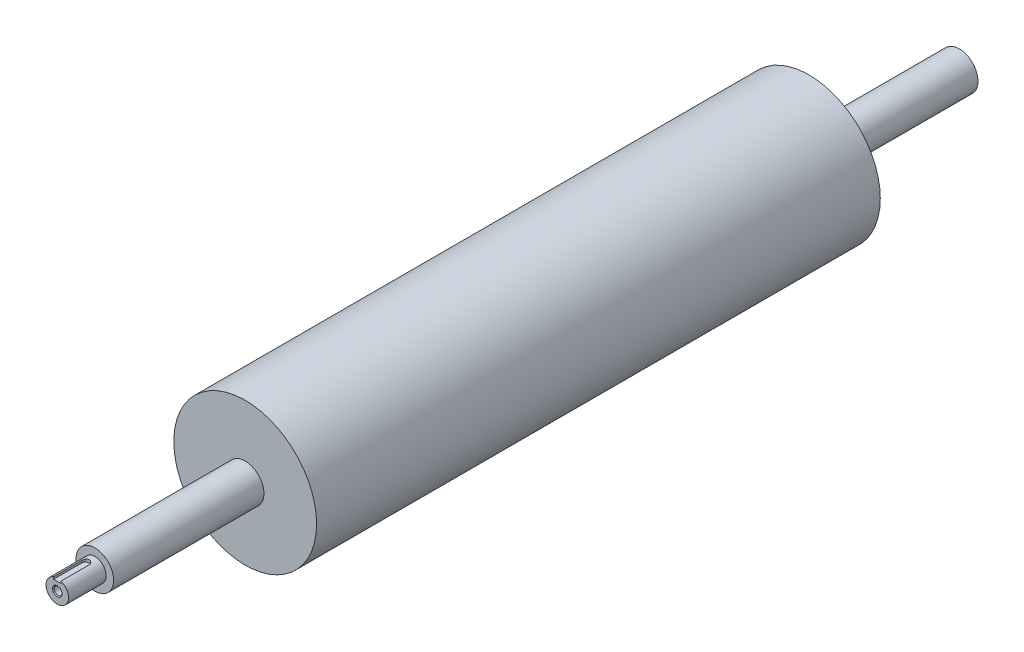
ISO-10303-21;
HEADER;
FILE_DESCRIPTION(('STEP AP214'),'2;1');
FILE_NAME('part.step','',(''),(''),'','','');
FILE_SCHEMA(('AUTOMOTIVE_DESIGN { 1 0 10303 214 1 1 1 1 }'));
ENDSEC;
DATA;
#1=APPLICATION_CONTEXT('core data for automotive mechanical design processes');
#2=APPLICATION_PROTOCOL_DEFINITION('international standard','automotive_design',2000,#1);
#3=PRODUCT_CONTEXT('',#1,'mechanical');
#4=PRODUCT('Part','Part','',(#3));
#5=PRODUCT_RELATED_PRODUCT_CATEGORY('part','',(#4));
#6=PRODUCT_DEFINITION_FORMATION('','',#4);
#7=PRODUCT_DEFINITION_CONTEXT('part definition',#1,'design');
#8=PRODUCT_DEFINITION('design','',#6,#7);
#9=PRODUCT_DEFINITION_SHAPE('','',#8);
#10=(LENGTH_UNIT() NAMED_UNIT(*) SI_UNIT(.MILLI.,.METRE.));
#11=(NAMED_UNIT(*) PLANE_ANGLE_UNIT() SI_UNIT($,.RADIAN.));
#12=(NAMED_UNIT(*) SI_UNIT($,.STERADIAN.) SOLID_ANGLE_UNIT());
#13=UNCERTAINTY_MEASURE_WITH_UNIT(LENGTH_MEASURE(1.E-05),#10,'distance_accuracy_value','');
#14=(GEOMETRIC_REPRESENTATION_CONTEXT(3) GLOBAL_UNCERTAINTY_ASSIGNED_CONTEXT((#13)) GLOBAL_UNIT_ASSIGNED_CONTEXT((#10,
#11,#12)) REPRESENTATION_CONTEXT('',''));
#15=CARTESIAN_POINT('',(0.,0.,0.));
#16=DIRECTION('',(0.,0.,1.));
#17=DIRECTION('',(1.,0.,0.));
#18=AXIS2_PLACEMENT_3D('',#15,#16,#17);
#19=CARTESIAN_POINT('',(0.,0.,150.));
#20=DIRECTION('',(0.,0.,-1.));
#21=DIRECTION('',(-1.,0.,0.));
#22=AXIS2_PLACEMENT_3D('',#19,#20,#21);
#23=CYLINDRICAL_SURFACE('',#22,38.);
#24=CARTESIAN_POINT('',(0.,0.,150.));
#25=DIRECTION('',(0.,0.,1.));
#26=DIRECTION('',(1.,0.,0.));
#27=AXIS2_PLACEMENT_3D('',#24,#25,#26);
#28=CIRCLE('',#27,38.);
#29=CARTESIAN_POINT('',(38.,0.,150.));
#30=VERTEX_POINT('',#29);
#31=EDGE_CURVE('E168',#30,#30,#28,.T.);
#32=ORIENTED_EDGE('',*,*,#31,.F.);
#33=EDGE_LOOP('',(#32));
#34=FACE_BOUND('',#33,.T.);
#35=CARTESIAN_POINT('',(0.,0.,-150.));
#36=DIRECTION('',(0.,0.,1.));
#37=DIRECTION('',(1.,0.,0.));
#38=AXIS2_PLACEMENT_3D('',#35,#36,#37);
#39=CIRCLE('',#38,38.);
#40=CARTESIAN_POINT('',(38.,0.,-150.));
#41=VERTEX_POINT('',#40);
#42=EDGE_CURVE('E167',#41,#41,#39,.T.);
#43=ORIENTED_EDGE('',*,*,#42,.T.);
#44=EDGE_LOOP('',(#43));
#45=FACE_BOUND('',#44,.T.);
#46=ADVANCED_FACE('F48',(#34,#45),#23,.T.);
#47=CARTESIAN_POINT('',(0.,0.,150.));
#48=DIRECTION('',(0.,0.,1.));
#49=DIRECTION('',(1.,0.,0.));
#50=AXIS2_PLACEMENT_3D('',#47,#48,#49);
#51=PLANE('',#50);
#52=CARTESIAN_POINT('',(0.,0.,150.));
#53=DIRECTION('',(0.,0.,1.));
#54=DIRECTION('',(1.,0.,0.));
#55=AXIS2_PLACEMENT_3D('',#52,#53,#54);
#56=CIRCLE('',#55,10.);
#57=CARTESIAN_POINT('',(10.,0.,150.));
#58=VERTEX_POINT('',#57);
#59=EDGE_CURVE('E152',#58,#58,#56,.T.);
#60=ORIENTED_EDGE('',*,*,#59,.F.);
#61=EDGE_LOOP('',(#60));
#62=FACE_BOUND('',#61,.T.);
#63=ORIENTED_EDGE('',*,*,#31,.T.);
#64=EDGE_LOOP('',(#63));
#65=FACE_BOUND('',#64,.T.);
#66=ADVANCED_FACE('F209',(#62,#65),#51,.T.);
#67=CARTESIAN_POINT('',(0.,0.,-150.));
#68=DIRECTION('',(0.,0.,1.));
#69=DIRECTION('',(1.,0.,0.));
#70=AXIS2_PLACEMENT_3D('',#67,#68,#69);
#71=PLANE('',#70);
#72=CARTESIAN_POINT('',(0.,0.,-150.));
#73=DIRECTION('',(0.,0.,1.));
#74=DIRECTION('',(1.,0.,0.));
#75=AXIS2_PLACEMENT_3D('',#72,#73,#74);
#76=CIRCLE('',#75,10.);
#77=CARTESIAN_POINT('',(10.,0.,-150.));
#78=VERTEX_POINT('',#77);
#79=EDGE_CURVE('E149',#78,#78,#76,.T.);
#80=ORIENTED_EDGE('',*,*,#79,.T.);
#81=EDGE_LOOP('',(#80));
#82=FACE_BOUND('',#81,.T.);
#83=ORIENTED_EDGE('',*,*,#42,.F.);
#84=EDGE_LOOP('',(#83));
#85=FACE_BOUND('',#84,.T.);
#86=ADVANCED_FACE('F206',(#82,#85),#71,.F.);
#87=CARTESIAN_POINT('',(0.,0.,230.));
#88=DIRECTION('',(0.,0.,-1.));
#89=DIRECTION('',(-1.,0.,0.));
#90=AXIS2_PLACEMENT_3D('',#87,#88,#89);
#91=CYLINDRICAL_SURFACE('',#90,10.);
#92=CARTESIAN_POINT('',(0.,0.,230.));
#93=DIRECTION('',(0.,0.,1.));
#94=DIRECTION('',(1.,0.,0.));
#95=AXIS2_PLACEMENT_3D('',#92,#93,#94);
#96=CIRCLE('',#95,10.);
#97=CARTESIAN_POINT('',(10.,0.,230.));
#98=VERTEX_POINT('',#97);
#99=EDGE_CURVE('E157',#98,#98,#96,.T.);
#100=ORIENTED_EDGE('',*,*,#99,.F.);
#101=EDGE_LOOP('',(#100));
#102=FACE_BOUND('',#101,.T.);
#103=ORIENTED_EDGE('',*,*,#59,.T.);
#104=EDGE_LOOP('',(#103));
#105=FACE_BOUND('',#104,.T.);
#106=ADVANCED_FACE('F199',(#102,#105),#91,.T.);
#107=CARTESIAN_POINT('',(0.,0.,230.));
#108=DIRECTION('',(0.,0.,1.));
#109=DIRECTION('',(1.,0.,0.));
#110=AXIS2_PLACEMENT_3D('',#107,#108,#109);
#111=PLANE('',#110);
#112=CARTESIAN_POINT('',(0.,0.,230.));
#113=DIRECTION('',(0.,0.,1.));
#114=DIRECTION('',(1.,0.,0.));
#115=AXIS2_PLACEMENT_3D('',#112,#113,#114);
#116=CIRCLE('',#115,6.);
#117=CARTESIAN_POINT('',(6.,0.,230.));
#118=VERTEX_POINT('',#117);
#119=EDGE_CURVE('E147',#118,#118,#116,.T.);
#120=ORIENTED_EDGE('',*,*,#119,.F.);
#121=EDGE_LOOP('',(#120));
#122=FACE_BOUND('',#121,.T.);
#123=ORIENTED_EDGE('',*,*,#99,.T.);
#124=EDGE_LOOP('',(#123));
#125=FACE_BOUND('',#124,.T.);
#126=ADVANCED_FACE('F198',(#122,#125),#111,.T.);
#127=CARTESIAN_POINT('',(0.,0.,-230.));
#128=DIRECTION('',(0.,0.,1.));
#129=DIRECTION('',(1.,0.,0.));
#130=AXIS2_PLACEMENT_3D('',#127,#128,#129);
#131=CYLINDRICAL_SURFACE('',#130,10.);
#132=CARTESIAN_POINT('',(0.,0.,-230.));
#133=DIRECTION('',(0.,0.,1.));
#134=DIRECTION('',(1.,0.,0.));
#135=AXIS2_PLACEMENT_3D('',#132,#133,#134);
#136=CIRCLE('',#135,10.);
#137=CARTESIAN_POINT('',(10.,0.,-230.));
#138=VERTEX_POINT('',#137);
#139=EDGE_CURVE('E154',#138,#138,#136,.T.);
#140=ORIENTED_EDGE('',*,*,#139,.T.);
#141=EDGE_LOOP('',(#140));
#142=FACE_BOUND('',#141,.T.);
#143=ORIENTED_EDGE('',*,*,#79,.F.);
#144=EDGE_LOOP('',(#143));
#145=FACE_BOUND('',#144,.T.);
#146=ADVANCED_FACE('F200',(#142,#145),#131,.T.);
#147=CARTESIAN_POINT('',(0.,0.,-230.));
#148=DIRECTION('',(0.,0.,-1.));
#149=DIRECTION('',(1.,0.,0.));
#150=AXIS2_PLACEMENT_3D('',#147,#148,#149);
#151=PLANE('',#150);
#152=ORIENTED_EDGE('',*,*,#139,.F.);
#153=EDGE_LOOP('',(#152));
#154=FACE_BOUND('',#153,.T.);
#155=ADVANCED_FACE('F195',(#154),#151,.T.);
#156=CARTESIAN_POINT('',(0.,0.,250.));
#157=DIRECTION('',(0.,0.,-1.));
#158=DIRECTION('',(-1.,0.,0.));
#159=AXIS2_PLACEMENT_3D('',#156,#157,#158);
#160=CYLINDRICAL_SURFACE('',#159,6.);
#161=CARTESIAN_POINT('',(0.,0.,250.));
#162=DIRECTION('',(0.,0.,1.));
#163=DIRECTION('',(1.,0.,0.));
#164=AXIS2_PLACEMENT_3D('',#161,#162,#163);
#165=CIRCLE('',#164,6.);
#166=CARTESIAN_POINT('',(-2.,5.65685424949238,250.));
#167=VERTEX_POINT('',#166);
#168=CARTESIAN_POINT('',(2.,5.65685424949238,250.));
#169=VERTEX_POINT('',#168);
#170=EDGE_CURVE('E144',#167,#169,#165,.T.);
#171=ORIENTED_EDGE('',*,*,#170,.F.);
#172=DIRECTION('',(0.,0.,-1.));
#173=VECTOR('',#172,1.);
#174=CARTESIAN_POINT('',(-2.,5.65685424949238,250.));
#175=LINE('',#174,#173);
#176=CARTESIAN_POINT('',(-2.,5.65685424949238,235.));
#177=VERTEX_POINT('',#176);
#178=EDGE_CURVE('E76',#167,#177,#175,.T.);
#179=ORIENTED_EDGE('',*,*,#178,.T.);
#180=CARTESIAN_POINT('',(-2.,5.65685424949238,235.));
#181=CARTESIAN_POINT('',(-2.0000014949184,5.65684884188678,234.945419006398));
#182=CARTESIAN_POINT('',(-1.99776424917479,5.6576451988649,234.890865875621));
#183=CARTESIAN_POINT('',(-1.9888512140728,5.66078654578442,234.78218283189));
#184=CARTESIAN_POINT('',(-1.98217662286705,5.66313111768244,234.728052808681));
#185=CARTESIAN_POINT('',(-1.95562135046157,5.67238184449302,234.56721571361));
#186=CARTESIAN_POINT('',(-1.92920846605622,5.6815058499903,234.461638307459));
#187=CARTESIAN_POINT('',(-1.85991682366085,5.70456149397718,234.256749615112));
#188=CARTESIAN_POINT('',(-1.81704715197506,5.71849047905859,234.157434906254));
#189=CARTESIAN_POINT('',(-1.71614645792973,5.74957574438922,233.967320331989));
#190=CARTESIAN_POINT('',(-1.65810612564546,5.76673400456217,233.876525741865));
#191=CARTESIAN_POINT('',(-1.52610278704601,5.80308960804095,233.702559537351));
#192=CARTESIAN_POINT('',(-1.45164996064407,5.82233755536618,233.619770239075));
#193=CARTESIAN_POINT('',(-1.28997688598296,5.86027697385956,233.467587964417));
#194=CARTESIAN_POINT('',(-1.20275436910906,5.87896834543706,233.398197373488));
#195=CARTESIAN_POINT('',(-1.01520729191251,5.91427765988455,233.273040962392));
#196=CARTESIAN_POINT('',(-0.914600178716988,5.93082875123708,233.217678031195));
#197=CARTESIAN_POINT('',(-0.704858499931719,5.95939217209317,233.124815496625));
#198=CARTESIAN_POINT('',(-0.595726551186838,5.97140588786619,233.087310436359));
#199=CARTESIAN_POINT('',(-0.376058690956069,5.98918142285845,233.032528547817));
#200=CARTESIAN_POINT('',(-0.265703668920221,5.99514617977147,233.014593454893));
#201=CARTESIAN_POINT('',(-0.0433979389113433,6.00087216807634,232.997367402949));
#202=CARTESIAN_POINT('',(0.0685523824907881,6.00063487762605,232.99807200146));
#203=CARTESIAN_POINT('',(0.286207690558788,5.99412077270532,233.017688566213));
#204=CARTESIAN_POINT('',(0.391985405251076,5.98808121982527,233.035885275919));
#205=CARTESIAN_POINT('',(0.598888128753318,5.97093921001647,233.088786397348));
#206=CARTESIAN_POINT('',(0.700012879232936,5.95983647235462,233.123491724413));
#207=CARTESIAN_POINT('',(0.896305246061935,5.93351336542608,233.208842739201));
#208=CARTESIAN_POINT('',(0.991377011307994,5.91824075676625,233.259692090245));
#209=CARTESIAN_POINT('',(1.17184917819498,5.88516775360088,233.375719902781));
#210=CARTESIAN_POINT('',(1.25724693942937,5.86736667195186,233.440902262093));
#211=CARTESIAN_POINT('',(1.42019467942243,5.83012543885479,233.587342099994));
#212=CARTESIAN_POINT('',(1.4971872232254,5.81064757359828,233.669211087219));
#213=CARTESIAN_POINT('',(1.63654404964076,5.77294980945702,233.844882979432));
#214=CARTESIAN_POINT('',(1.69890360636762,5.75473031831507,233.938689724806));
#215=CARTESIAN_POINT('',(1.80800665118557,5.72140062752635,234.137360356707));
#216=CARTESIAN_POINT('',(1.85450601901537,5.70634029896469,234.242367029866));
#217=CARTESIAN_POINT('',(1.92892046140224,5.68162194124078,234.45929395518));
#218=CARTESIAN_POINT('',(1.95686487211072,5.67195538817986,234.571202986744));
#219=CARTESIAN_POINT('',(1.98331631256166,5.6627308418944,234.736837273496));
#220=CARTESIAN_POINT('',(1.98957012251023,5.66053335389204,234.789282779708));
#221=CARTESIAN_POINT('',(1.99790923214239,5.65759407142798,234.8944761568));
#222=CARTESIAN_POINT('',(1.99999991078996,5.65685039859056,234.947223549089));
#223=CARTESIAN_POINT('',(2.,5.65685424949238,235.));
#224=B_SPLINE_CURVE_WITH_KNOTS('',3,(#180,#181,#182,#183,#184,#185,#186,#187,#188,#189,#190,
#191,#192,#193,#194,#195,#196,#197,#198,#199,#200,#201,#202,#203,#204,#205,#206,#207,#208,#209,
#210,#211,#212,#213,#214,#215,#216,#217,#218,#219,#220,#221,#222,#223),.UNSPECIFIED.,.F.,.F.,(4,
2,2,2,2,2,2,2,2,2,2,2,2,2,2,2,2,2,2,2,2,4),(0.,0.163636969470881,0.327229772338919,
0.653162396790756,0.978915321932496,1.30486862627063,1.64233009925357,1.97985159727496,
2.32618265866202,2.67240782242255,3.00658941454805,3.34069136061284,3.6616883693147,
3.98270317816495,4.30794037651935,4.63326613177537,4.97388108116099,5.31460588498484,
5.66036059856082,6.0055673497368,6.16399790665504,6.32222363058112),.UNSPECIFIED.);
#225=CARTESIAN_POINT('',(2.,5.65685424949238,235.));
#226=VERTEX_POINT('',#225);
#227=EDGE_CURVE('E11',#177,#226,#224,.T.);
#228=ORIENTED_EDGE('',*,*,#227,.T.);
#229=DIRECTION('',(0.,0.,-1.));
#230=VECTOR('',#229,1.);
#231=CARTESIAN_POINT('',(2.,5.65685424949238,250.));
#232=LINE('',#231,#230);
#233=EDGE_CURVE('E128',#226,#169,#232,.F.);
#234=ORIENTED_EDGE('',*,*,#233,.T.);
#235=EDGE_LOOP('',(#171,#179,#228,#234));
#236=FACE_BOUND('',#235,.T.);
#237=ORIENTED_EDGE('',*,*,#119,.T.);
#238=EDGE_LOOP('',(#237));
#239=FACE_BOUND('',#238,.T.);
#240=ADVANCED_FACE('F190',(#236,#239),#160,.T.);
#241=CARTESIAN_POINT('',(0.,0.,250.));
#242=DIRECTION('',(0.,0.,1.));
#243=DIRECTION('',(1.,0.,0.));
#244=AXIS2_PLACEMENT_3D('',#241,#242,#243);
#245=PLANE('',#244);
#246=CARTESIAN_POINT('',(0.,0.,250.));
#247=DIRECTION('',(0.,0.,1.));
#248=DIRECTION('',(1.,0.,0.));
#249=AXIS2_PLACEMENT_3D('',#246,#247,#248);
#250=CIRCLE('',#249,2.525);
#251=CARTESIAN_POINT('',(2.525,0.,250.));
#252=VERTEX_POINT('',#251);
#253=EDGE_CURVE('E119',#252,#252,#250,.T.);
#254=ORIENTED_EDGE('',*,*,#253,.F.);
#255=EDGE_LOOP('',(#254));
#256=FACE_BOUND('',#255,.T.);
#257=DIRECTION('',(0.,1.,0.));
#258=VECTOR('',#257,1.);
#259=CARTESIAN_POINT('',(-2.,4.5,250.));
#260=LINE('',#259,#258);
#261=CARTESIAN_POINT('',(-2.,4.5,250.));
#262=VERTEX_POINT('',#261);
#263=EDGE_CURVE('E130',#262,#167,#260,.T.);
#264=ORIENTED_EDGE('',*,*,#263,.T.);
#265=ORIENTED_EDGE('',*,*,#170,.T.);
#266=DIRECTION('',(0.,1.,0.));
#267=VECTOR('',#266,1.);
#268=CARTESIAN_POINT('',(2.,4.5,250.));
#269=LINE('',#268,#267);
#270=CARTESIAN_POINT('',(2.,4.5,250.));
#271=VERTEX_POINT('',#270);
#272=EDGE_CURVE('E127',#271,#169,#269,.T.);
#273=ORIENTED_EDGE('',*,*,#272,.F.);
#274=DIRECTION('',(-1.,0.,0.));
#275=VECTOR('',#274,1.);
#276=CARTESIAN_POINT('',(0.,4.5,250.));
#277=LINE('',#276,#275);
#278=EDGE_CURVE('E62',#271,#262,#277,.T.);
#279=ORIENTED_EDGE('',*,*,#278,.T.);
#280=EDGE_LOOP('',(#264,#265,#273,#279));
#281=FACE_BOUND('',#280,.T.);
#282=ADVANCED_FACE('F179',(#256,#281),#245,.T.);
#283=CARTESIAN_POINT('',(0.,4.5,235.));
#284=DIRECTION('',(0.,1.,0.));
#285=DIRECTION('',(0.,0.,1.));
#286=AXIS2_PLACEMENT_3D('',#283,#284,#285);
#287=CYLINDRICAL_SURFACE('',#286,2.);
#288=DIRECTION('',(0.,1.,0.));
#289=VECTOR('',#288,1.);
#290=CARTESIAN_POINT('',(-2.,4.5,235.));
#291=LINE('',#290,#289);
#292=CARTESIAN_POINT('',(-2.,4.5,235.));
#293=VERTEX_POINT('',#292);
#294=EDGE_CURVE('E131',#293,#177,#291,.T.);
#295=ORIENTED_EDGE('',*,*,#294,.F.);
#296=CARTESIAN_POINT('',(0.,4.5,235.));
#297=DIRECTION('',(0.,1.,0.));
#298=DIRECTION('',(0.,0.,1.));
#299=AXIS2_PLACEMENT_3D('',#296,#297,#298);
#300=CIRCLE('',#299,2.);
#301=CARTESIAN_POINT('',(2.,4.5,235.));
#302=VERTEX_POINT('',#301);
#303=EDGE_CURVE('E113',#302,#293,#300,.T.);
#304=ORIENTED_EDGE('',*,*,#303,.F.);
#305=DIRECTION('',(0.,1.,0.));
#306=VECTOR('',#305,1.);
#307=CARTESIAN_POINT('',(2.,4.5,235.));
#308=LINE('',#307,#306);
#309=EDGE_CURVE('E133',#302,#226,#308,.T.);
#310=ORIENTED_EDGE('',*,*,#309,.T.);
#311=ORIENTED_EDGE('',*,*,#227,.F.);
#312=EDGE_LOOP('',(#295,#304,#310,#311));
#313=FACE_BOUND('',#312,.T.);
#314=ADVANCED_FACE('F187',(#313),#287,.F.);
#315=CARTESIAN_POINT('',(-2.,4.5,250.));
#316=DIRECTION('',(-1.,0.,0.));
#317=DIRECTION('',(0.,0.,1.));
#318=AXIS2_PLACEMENT_3D('',#315,#316,#317);
#319=PLANE('',#318);
#320=ORIENTED_EDGE('',*,*,#263,.F.);
#321=DIRECTION('',(0.,0.,1.));
#322=VECTOR('',#321,1.);
#323=CARTESIAN_POINT('',(-2.,4.5,250.));
#324=LINE('',#323,#322);
#325=EDGE_CURVE('E67',#293,#262,#324,.T.);
#326=ORIENTED_EDGE('',*,*,#325,.F.);
#327=ORIENTED_EDGE('',*,*,#294,.T.);
#328=ORIENTED_EDGE('',*,*,#178,.F.);
#329=EDGE_LOOP('',(#320,#326,#327,#328));
#330=FACE_BOUND('',#329,.T.);
#331=ADVANCED_FACE('F189',(#330),#319,.F.);
#332=CARTESIAN_POINT('',(2.,4.5,250.));
#333=DIRECTION('',(1.,0.,0.));
#334=DIRECTION('',(0.,0.,-1.));
#335=AXIS2_PLACEMENT_3D('',#332,#333,#334);
#336=PLANE('',#335);
#337=ORIENTED_EDGE('',*,*,#309,.F.);
#338=DIRECTION('',(0.,0.,-1.));
#339=VECTOR('',#338,1.);
#340=CARTESIAN_POINT('',(2.,4.5,250.));
#341=LINE('',#340,#339);
#342=EDGE_CURVE('E108',#271,#302,#341,.T.);
#343=ORIENTED_EDGE('',*,*,#342,.F.);
#344=ORIENTED_EDGE('',*,*,#272,.T.);
#345=ORIENTED_EDGE('',*,*,#233,.F.);
#346=EDGE_LOOP('',(#337,#343,#344,#345));
#347=FACE_BOUND('',#346,.T.);
#348=ADVANCED_FACE('F184',(#347),#336,.F.);
#349=CARTESIAN_POINT('',(0.,4.5,250.));
#350=DIRECTION('',(0.,1.,0.));
#351=DIRECTION('',(0.,0.,1.));
#352=AXIS2_PLACEMENT_3D('',#349,#350,#351);
#353=PLANE('',#352);
#354=ORIENTED_EDGE('',*,*,#342,.T.);
#355=ORIENTED_EDGE('',*,*,#303,.T.);
#356=ORIENTED_EDGE('',*,*,#325,.T.);
#357=ORIENTED_EDGE('',*,*,#278,.F.);
#358=EDGE_LOOP('',(#354,#355,#356,#357));
#359=FACE_BOUND('',#358,.T.);
#360=ADVANCED_FACE('F105',(#359),#353,.T.);
#361=CARTESIAN_POINT('',(0.,0.,237.6));
#362=DIRECTION('',(0.,0.,1.));
#363=DIRECTION('',(1.,0.,0.));
#364=AXIS2_PLACEMENT_3D('',#361,#362,#363);
#365=CONICAL_SURFACE('',#364,2.1,1.02974425867665);
#366=CARTESIAN_POINT('',(0.,0.,236.338192700042));
#367=VERTEX_POINT('',#366);
#368=VERTEX_LOOP('',#367);
#369=FACE_BOUND('',#368,.T.);
#370=CARTESIAN_POINT('',(0.,0.,237.6));
#371=DIRECTION('',(0.,0.,1.));
#372=DIRECTION('',(1.,0.,0.));
#373=AXIS2_PLACEMENT_3D('',#370,#371,#372);
#374=CIRCLE('',#373,2.1);
#375=CARTESIAN_POINT('',(2.1,0.,237.6));
#376=VERTEX_POINT('',#375);
#377=EDGE_CURVE('E106',#376,#376,#374,.T.);
#378=ORIENTED_EDGE('',*,*,#377,.T.);
#379=EDGE_LOOP('',(#378));
#380=FACE_BOUND('',#379,.T.);
#381=ADVANCED_FACE('F98',(#369,#380),#365,.F.);
#382=CARTESIAN_POINT('',(0.,0.,250.));
#383=DIRECTION('',(0.,0.,1.));
#384=DIRECTION('',(1.,0.,0.));
#385=AXIS2_PLACEMENT_3D('',#382,#383,#384);
#386=CYLINDRICAL_SURFACE('',#385,2.1);
#387=ORIENTED_EDGE('',*,*,#377,.F.);
#388=EDGE_LOOP('',(#387));
#389=FACE_BOUND('',#388,.T.);
#390=CARTESIAN_POINT('',(0.,0.,249.575));
#391=DIRECTION('',(0.,0.,1.));
#392=DIRECTION('',(1.,0.,0.));
#393=AXIS2_PLACEMENT_3D('',#390,#391,#392);
#394=CIRCLE('',#393,2.1);
#395=CARTESIAN_POINT('',(2.1,0.,249.575));
#396=VERTEX_POINT('',#395);
#397=EDGE_CURVE('E109',#396,#396,#394,.T.);
#398=ORIENTED_EDGE('',*,*,#397,.T.);
#399=EDGE_LOOP('',(#398));
#400=FACE_BOUND('',#399,.T.);
#401=ADVANCED_FACE('F101',(#389,#400),#386,.F.);
#402=CARTESIAN_POINT('',(0.,0.,250.));
#403=DIRECTION('',(0.,0.,1.));
#404=DIRECTION('',(1.,0.,0.));
#405=AXIS2_PLACEMENT_3D('',#402,#403,#404);
#406=CONICAL_SURFACE('',#405,2.525,0.785398163397438);
#407=ORIENTED_EDGE('',*,*,#397,.F.);
#408=EDGE_LOOP('',(#407));
#409=FACE_BOUND('',#408,.T.);
#410=ORIENTED_EDGE('',*,*,#253,.T.);
#411=EDGE_LOOP('',(#410));
#412=FACE_BOUND('',#411,.T.);
#413=ADVANCED_FACE('F245',(#409,#412),#406,.F.);
#414=CLOSED_SHELL('',(#46,#66,#86,#106,#126,#146,#155,#240,#282,#314,#331,#348,#360,#381,#401,#413));
#415=MANIFOLD_SOLID_BREP('B2',#414);
#416=ADVANCED_BREP_SHAPE_REPRESENTATION('',(#18,#415),#14);
#417=SHAPE_DEFINITION_REPRESENTATION(#9,#416);
ENDSEC;
END-ISO-10303-21;
